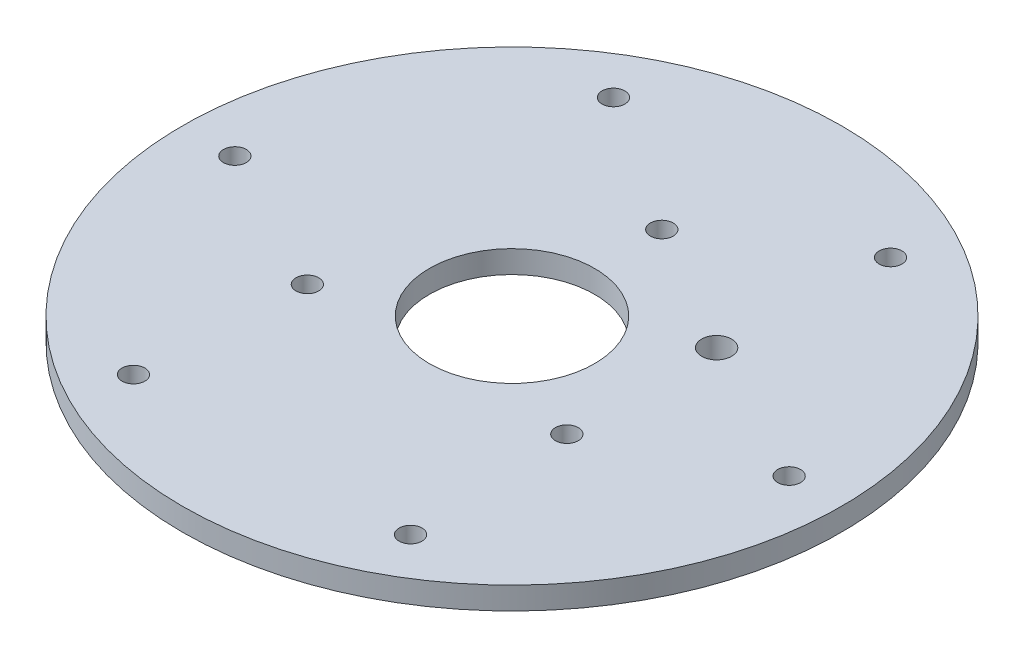
ISO-10303-21;
HEADER;
FILE_DESCRIPTION(('STEP AP214'),'2;1');
FILE_NAME('part.step','',(''),(''),'','','');
FILE_SCHEMA(('AUTOMOTIVE_DESIGN { 1 0 10303 214 1 1 1 1 }'));
ENDSEC;
DATA;
#1=APPLICATION_CONTEXT('core data for automotive mechanical design processes');
#2=APPLICATION_PROTOCOL_DEFINITION('international standard','automotive_design',2000,#1);
#3=PRODUCT_CONTEXT('',#1,'mechanical');
#4=PRODUCT('Part','Part','',(#3));
#5=PRODUCT_RELATED_PRODUCT_CATEGORY('part','',(#4));
#6=PRODUCT_DEFINITION_FORMATION('','',#4);
#7=PRODUCT_DEFINITION_CONTEXT('part definition',#1,'design');
#8=PRODUCT_DEFINITION('design','',#6,#7);
#9=PRODUCT_DEFINITION_SHAPE('','',#8);
#10=(LENGTH_UNIT() NAMED_UNIT(*) SI_UNIT(.MILLI.,.METRE.));
#11=(NAMED_UNIT(*) PLANE_ANGLE_UNIT() SI_UNIT($,.RADIAN.));
#12=(NAMED_UNIT(*) SI_UNIT($,.STERADIAN.) SOLID_ANGLE_UNIT());
#13=UNCERTAINTY_MEASURE_WITH_UNIT(LENGTH_MEASURE(1.E-05),#10,'distance_accuracy_value','');
#14=(GEOMETRIC_REPRESENTATION_CONTEXT(3) GLOBAL_UNCERTAINTY_ASSIGNED_CONTEXT((#13)) GLOBAL_UNIT_ASSIGNED_CONTEXT((#10,
#11,#12)) REPRESENTATION_CONTEXT('',''));
#15=CARTESIAN_POINT('',(0.,0.,0.));
#16=DIRECTION('',(0.,0.,1.));
#17=DIRECTION('',(1.,0.,0.));
#18=AXIS2_PLACEMENT_3D('',#15,#16,#17);
#19=CARTESIAN_POINT('',(37.,3.,0.));
#20=DIRECTION('',(0.,-1.,0.));
#21=DIRECTION('',(0.,0.,-1.));
#22=AXIS2_PLACEMENT_3D('',#19,#20,#21);
#23=CYLINDRICAL_SURFACE('',#22,1.525);
#24=CARTESIAN_POINT('',(37.,3.,0.));
#25=DIRECTION('',(0.,1.,0.));
#26=DIRECTION('',(0.,0.,1.));
#27=AXIS2_PLACEMENT_3D('',#24,#25,#26);
#28=CIRCLE('',#27,1.525);
#29=CARTESIAN_POINT('',(37.,3.,1.525));
#30=VERTEX_POINT('',#29);
#31=EDGE_CURVE('E58',#30,#30,#28,.T.);
#32=ORIENTED_EDGE('',*,*,#31,.T.);
#33=EDGE_LOOP('',(#32));
#34=FACE_BOUND('',#33,.T.);
#35=CARTESIAN_POINT('',(37.,0.,0.));
#36=DIRECTION('',(0.,1.,0.));
#37=DIRECTION('',(0.,0.,1.));
#38=AXIS2_PLACEMENT_3D('',#35,#36,#37);
#39=CIRCLE('',#38,1.525);
#40=CARTESIAN_POINT('',(37.,0.,1.525));
#41=VERTEX_POINT('',#40);
#42=EDGE_CURVE('E109',#41,#41,#39,.T.);
#43=ORIENTED_EDGE('',*,*,#42,.F.);
#44=EDGE_LOOP('',(#43));
#45=FACE_BOUND('',#44,.T.);
#46=ADVANCED_FACE('F51',(#34,#45),#23,.F.);
#47=CARTESIAN_POINT('',(18.5,3.,32.0429399400242));
#48=DIRECTION('',(0.,-1.,0.));
#49=DIRECTION('',(0.,0.,-1.));
#50=AXIS2_PLACEMENT_3D('',#47,#48,#49);
#51=CYLINDRICAL_SURFACE('',#50,1.525);
#52=CARTESIAN_POINT('',(18.5,3.,32.0429399400242));
#53=DIRECTION('',(0.,1.,0.));
#54=DIRECTION('',(0.,0.,1.));
#55=AXIS2_PLACEMENT_3D('',#52,#53,#54);
#56=CIRCLE('',#55,1.525);
#57=CARTESIAN_POINT('',(18.5,3.,33.5679399400242));
#58=VERTEX_POINT('',#57);
#59=EDGE_CURVE('E66',#58,#58,#56,.T.);
#60=ORIENTED_EDGE('',*,*,#59,.T.);
#61=EDGE_LOOP('',(#60));
#62=FACE_BOUND('',#61,.T.);
#63=CARTESIAN_POINT('',(18.5,0.,32.0429399400242));
#64=DIRECTION('',(0.,1.,0.));
#65=DIRECTION('',(0.,0.,1.));
#66=AXIS2_PLACEMENT_3D('',#63,#64,#65);
#67=CIRCLE('',#66,1.525);
#68=CARTESIAN_POINT('',(18.5,0.,33.5679399400242));
#69=VERTEX_POINT('',#68);
#70=EDGE_CURVE('E110',#69,#69,#67,.T.);
#71=ORIENTED_EDGE('',*,*,#70,.F.);
#72=EDGE_LOOP('',(#71));
#73=FACE_BOUND('',#72,.T.);
#74=ADVANCED_FACE('F164',(#62,#73),#51,.F.);
#75=CARTESIAN_POINT('',(-18.5,3.,32.0429399400242));
#76=DIRECTION('',(0.,-1.,0.));
#77=DIRECTION('',(0.,0.,-1.));
#78=AXIS2_PLACEMENT_3D('',#75,#76,#77);
#79=CYLINDRICAL_SURFACE('',#78,1.52499999999999);
#80=CARTESIAN_POINT('',(-18.5,3.,32.0429399400242));
#81=DIRECTION('',(0.,1.,0.));
#82=DIRECTION('',(0.,0.,1.));
#83=AXIS2_PLACEMENT_3D('',#80,#81,#82);
#84=CIRCLE('',#83,1.52499999999999);
#85=CARTESIAN_POINT('',(-18.5,3.,33.5679399400242));
#86=VERTEX_POINT('',#85);
#87=EDGE_CURVE('E160',#86,#86,#84,.T.);
#88=ORIENTED_EDGE('',*,*,#87,.T.);
#89=EDGE_LOOP('',(#88));
#90=FACE_BOUND('',#89,.T.);
#91=CARTESIAN_POINT('',(-18.5,0.,32.0429399400242));
#92=DIRECTION('',(0.,1.,0.));
#93=DIRECTION('',(0.,0.,1.));
#94=AXIS2_PLACEMENT_3D('',#91,#92,#93);
#95=CIRCLE('',#94,1.52499999999999);
#96=CARTESIAN_POINT('',(-18.5,0.,33.5679399400242));
#97=VERTEX_POINT('',#96);
#98=EDGE_CURVE('E102',#97,#97,#95,.T.);
#99=ORIENTED_EDGE('',*,*,#98,.F.);
#100=EDGE_LOOP('',(#99));
#101=FACE_BOUND('',#100,.T.);
#102=ADVANCED_FACE('F185',(#90,#101),#79,.F.);
#103=CARTESIAN_POINT('',(-37.,3.,0.));
#104=DIRECTION('',(0.,-1.,0.));
#105=DIRECTION('',(0.,0.,-1.));
#106=AXIS2_PLACEMENT_3D('',#103,#104,#105);
#107=CYLINDRICAL_SURFACE('',#106,1.525);
#108=CARTESIAN_POINT('',(-37.,3.,0.));
#109=DIRECTION('',(0.,1.,0.));
#110=DIRECTION('',(0.,0.,1.));
#111=AXIS2_PLACEMENT_3D('',#108,#109,#110);
#112=CIRCLE('',#111,1.525);
#113=CARTESIAN_POINT('',(-37.,3.,1.525));
#114=VERTEX_POINT('',#113);
#115=EDGE_CURVE('E153',#114,#114,#112,.T.);
#116=ORIENTED_EDGE('',*,*,#115,.T.);
#117=EDGE_LOOP('',(#116));
#118=FACE_BOUND('',#117,.T.);
#119=CARTESIAN_POINT('',(-37.,0.,0.));
#120=DIRECTION('',(0.,1.,0.));
#121=DIRECTION('',(0.,0.,1.));
#122=AXIS2_PLACEMENT_3D('',#119,#120,#121);
#123=CIRCLE('',#122,1.525);
#124=CARTESIAN_POINT('',(-37.,0.,1.525));
#125=VERTEX_POINT('',#124);
#126=EDGE_CURVE('E99',#125,#125,#123,.T.);
#127=ORIENTED_EDGE('',*,*,#126,.F.);
#128=EDGE_LOOP('',(#127));
#129=FACE_BOUND('',#128,.T.);
#130=ADVANCED_FACE('F189',(#118,#129),#107,.F.);
#131=CARTESIAN_POINT('',(-18.5,3.,-32.0429399400242));
#132=DIRECTION('',(0.,-1.,0.));
#133=DIRECTION('',(0.,0.,-1.));
#134=AXIS2_PLACEMENT_3D('',#131,#132,#133);
#135=CYLINDRICAL_SURFACE('',#134,1.525);
#136=CARTESIAN_POINT('',(-18.5,3.,-32.0429399400242));
#137=DIRECTION('',(0.,1.,0.));
#138=DIRECTION('',(0.,0.,1.));
#139=AXIS2_PLACEMENT_3D('',#136,#137,#138);
#140=CIRCLE('',#139,1.525);
#141=CARTESIAN_POINT('',(-18.5,3.,-30.5179399400242));
#142=VERTEX_POINT('',#141);
#143=EDGE_CURVE('E149',#142,#142,#140,.T.);
#144=ORIENTED_EDGE('',*,*,#143,.T.);
#145=EDGE_LOOP('',(#144));
#146=FACE_BOUND('',#145,.T.);
#147=CARTESIAN_POINT('',(-18.5,0.,-32.0429399400242));
#148=DIRECTION('',(0.,1.,0.));
#149=DIRECTION('',(0.,0.,1.));
#150=AXIS2_PLACEMENT_3D('',#147,#148,#149);
#151=CIRCLE('',#150,1.525);
#152=CARTESIAN_POINT('',(-18.5,0.,-30.5179399400242));
#153=VERTEX_POINT('',#152);
#154=EDGE_CURVE('E96',#153,#153,#151,.T.);
#155=ORIENTED_EDGE('',*,*,#154,.F.);
#156=EDGE_LOOP('',(#155));
#157=FACE_BOUND('',#156,.T.);
#158=ADVANCED_FACE('F194',(#146,#157),#135,.F.);
#159=CARTESIAN_POINT('',(18.5,3.,-32.0429399400243));
#160=DIRECTION('',(0.,-1.,0.));
#161=DIRECTION('',(0.,0.,-1.));
#162=AXIS2_PLACEMENT_3D('',#159,#160,#161);
#163=CYLINDRICAL_SURFACE('',#162,1.525);
#164=CARTESIAN_POINT('',(18.5,3.,-32.0429399400243));
#165=DIRECTION('',(0.,1.,0.));
#166=DIRECTION('',(0.,0.,1.));
#167=AXIS2_PLACEMENT_3D('',#164,#165,#166);
#168=CIRCLE('',#167,1.525);
#169=CARTESIAN_POINT('',(18.5,3.,-30.5179399400242));
#170=VERTEX_POINT('',#169);
#171=EDGE_CURVE('E148',#170,#170,#168,.T.);
#172=ORIENTED_EDGE('',*,*,#171,.T.);
#173=EDGE_LOOP('',(#172));
#174=FACE_BOUND('',#173,.T.);
#175=CARTESIAN_POINT('',(18.5,0.,-32.0429399400243));
#176=DIRECTION('',(0.,1.,0.));
#177=DIRECTION('',(0.,0.,1.));
#178=AXIS2_PLACEMENT_3D('',#175,#176,#177);
#179=CIRCLE('',#178,1.525);
#180=CARTESIAN_POINT('',(18.5,0.,-30.5179399400242));
#181=VERTEX_POINT('',#180);
#182=EDGE_CURVE('E95',#181,#181,#179,.T.);
#183=ORIENTED_EDGE('',*,*,#182,.F.);
#184=EDGE_LOOP('',(#183));
#185=FACE_BOUND('',#184,.T.);
#186=ADVANCED_FACE('F197',(#174,#185),#163,.F.);
#187=CARTESIAN_POINT('',(0.,3.,0.));
#188=DIRECTION('',(0.,-1.,0.));
#189=DIRECTION('',(0.,0.,-1.));
#190=AXIS2_PLACEMENT_3D('',#187,#188,#189);
#191=CYLINDRICAL_SURFACE('',#190,11.025);
#192=CARTESIAN_POINT('',(0.,3.,0.));
#193=DIRECTION('',(0.,1.,0.));
#194=DIRECTION('',(0.,0.,1.));
#195=AXIS2_PLACEMENT_3D('',#192,#193,#194);
#196=CIRCLE('',#195,11.025);
#197=CARTESIAN_POINT('',(0.,3.,11.025));
#198=VERTEX_POINT('',#197);
#199=EDGE_CURVE('E142',#198,#198,#196,.T.);
#200=ORIENTED_EDGE('',*,*,#199,.T.);
#201=EDGE_LOOP('',(#200));
#202=FACE_BOUND('',#201,.T.);
#203=CARTESIAN_POINT('',(0.,0.,0.));
#204=DIRECTION('',(0.,1.,0.));
#205=DIRECTION('',(0.,0.,1.));
#206=AXIS2_PLACEMENT_3D('',#203,#204,#205);
#207=CIRCLE('',#206,11.025);
#208=CARTESIAN_POINT('',(0.,0.,11.025));
#209=VERTEX_POINT('',#208);
#210=EDGE_CURVE('E86',#209,#209,#207,.T.);
#211=ORIENTED_EDGE('',*,*,#210,.F.);
#212=EDGE_LOOP('',(#211));
#213=FACE_BOUND('',#212,.T.);
#214=ADVANCED_FACE('F203',(#202,#213),#191,.F.);
#215=CARTESIAN_POINT('',(0.,3.,-20.));
#216=DIRECTION('',(0.,-1.,0.));
#217=DIRECTION('',(0.,0.,-1.));
#218=AXIS2_PLACEMENT_3D('',#215,#216,#217);
#219=CYLINDRICAL_SURFACE('',#218,1.525);
#220=CARTESIAN_POINT('',(0.,3.,-20.));
#221=DIRECTION('',(0.,1.,0.));
#222=DIRECTION('',(0.,0.,1.));
#223=AXIS2_PLACEMENT_3D('',#220,#221,#222);
#224=CIRCLE('',#223,1.525);
#225=CARTESIAN_POINT('',(0.,3.,-18.475));
#226=VERTEX_POINT('',#225);
#227=EDGE_CURVE('E139',#226,#226,#224,.T.);
#228=ORIENTED_EDGE('',*,*,#227,.T.);
#229=EDGE_LOOP('',(#228));
#230=FACE_BOUND('',#229,.T.);
#231=CARTESIAN_POINT('',(0.,0.,-20.));
#232=DIRECTION('',(0.,1.,0.));
#233=DIRECTION('',(0.,0.,1.));
#234=AXIS2_PLACEMENT_3D('',#231,#232,#233);
#235=CIRCLE('',#234,1.525);
#236=CARTESIAN_POINT('',(0.,0.,-18.475));
#237=VERTEX_POINT('',#236);
#238=EDGE_CURVE('E81',#237,#237,#235,.T.);
#239=ORIENTED_EDGE('',*,*,#238,.F.);
#240=EDGE_LOOP('',(#239));
#241=FACE_BOUND('',#240,.T.);
#242=ADVANCED_FACE('F202',(#230,#241),#219,.F.);
#243=CARTESIAN_POINT('',(17.3205080756888,3.,10.));
#244=DIRECTION('',(0.,-1.,0.));
#245=DIRECTION('',(0.,0.,-1.));
#246=AXIS2_PLACEMENT_3D('',#243,#244,#245);
#247=CYLINDRICAL_SURFACE('',#246,1.525);
#248=CARTESIAN_POINT('',(17.3205080756888,3.,10.));
#249=DIRECTION('',(0.,1.,0.));
#250=DIRECTION('',(0.,0.,1.));
#251=AXIS2_PLACEMENT_3D('',#248,#249,#250);
#252=CIRCLE('',#251,1.525);
#253=CARTESIAN_POINT('',(17.3205080756888,3.,11.525));
#254=VERTEX_POINT('',#253);
#255=EDGE_CURVE('E131',#254,#254,#252,.T.);
#256=ORIENTED_EDGE('',*,*,#255,.T.);
#257=EDGE_LOOP('',(#256));
#258=FACE_BOUND('',#257,.T.);
#259=CARTESIAN_POINT('',(17.3205080756888,0.,10.));
#260=DIRECTION('',(0.,1.,0.));
#261=DIRECTION('',(0.,0.,1.));
#262=AXIS2_PLACEMENT_3D('',#259,#260,#261);
#263=CIRCLE('',#262,1.525);
#264=CARTESIAN_POINT('',(17.3205080756888,0.,11.525));
#265=VERTEX_POINT('',#264);
#266=EDGE_CURVE('E77',#265,#265,#263,.T.);
#267=ORIENTED_EDGE('',*,*,#266,.F.);
#268=EDGE_LOOP('',(#267));
#269=FACE_BOUND('',#268,.T.);
#270=ADVANCED_FACE('F207',(#258,#269),#247,.F.);
#271=CARTESIAN_POINT('',(-17.3205080756888,3.,10.));
#272=DIRECTION('',(0.,-1.,0.));
#273=DIRECTION('',(0.,0.,-1.));
#274=AXIS2_PLACEMENT_3D('',#271,#272,#273);
#275=CYLINDRICAL_SURFACE('',#274,1.525);
#276=CARTESIAN_POINT('',(-17.3205080756888,3.,10.));
#277=DIRECTION('',(0.,1.,0.));
#278=DIRECTION('',(0.,0.,1.));
#279=AXIS2_PLACEMENT_3D('',#276,#277,#278);
#280=CIRCLE('',#279,1.525);
#281=CARTESIAN_POINT('',(-17.3205080756888,3.,11.525));
#282=VERTEX_POINT('',#281);
#283=EDGE_CURVE('E127',#282,#282,#280,.T.);
#284=ORIENTED_EDGE('',*,*,#283,.T.);
#285=EDGE_LOOP('',(#284));
#286=FACE_BOUND('',#285,.T.);
#287=CARTESIAN_POINT('',(-17.3205080756888,0.,10.));
#288=DIRECTION('',(0.,1.,0.));
#289=DIRECTION('',(0.,0.,1.));
#290=AXIS2_PLACEMENT_3D('',#287,#288,#289);
#291=CIRCLE('',#290,1.525);
#292=CARTESIAN_POINT('',(-17.3205080756888,0.,11.525));
#293=VERTEX_POINT('',#292);
#294=EDGE_CURVE('E78',#293,#293,#291,.T.);
#295=ORIENTED_EDGE('',*,*,#294,.F.);
#296=EDGE_LOOP('',(#295));
#297=FACE_BOUND('',#296,.T.);
#298=ADVANCED_FACE('F215',(#286,#297),#275,.F.);
#299=CARTESIAN_POINT('',(17.3205080756888,3.,-10.));
#300=DIRECTION('',(0.,-1.,0.));
#301=DIRECTION('',(0.,0.,-1.));
#302=AXIS2_PLACEMENT_3D('',#299,#300,#301);
#303=CYLINDRICAL_SURFACE('',#302,2.);
#304=CARTESIAN_POINT('',(17.3205080756888,3.,-10.));
#305=DIRECTION('',(0.,1.,0.));
#306=DIRECTION('',(0.,0.,1.));
#307=AXIS2_PLACEMENT_3D('',#304,#305,#306);
#308=CIRCLE('',#307,2.);
#309=CARTESIAN_POINT('',(17.3205080756888,3.,-8.00000000000003));
#310=VERTEX_POINT('',#309);
#311=EDGE_CURVE('E119',#310,#310,#308,.T.);
#312=ORIENTED_EDGE('',*,*,#311,.T.);
#313=EDGE_LOOP('',(#312));
#314=FACE_BOUND('',#313,.T.);
#315=CARTESIAN_POINT('',(17.3205080756888,0.,-10.));
#316=DIRECTION('',(0.,1.,0.));
#317=DIRECTION('',(0.,0.,1.));
#318=AXIS2_PLACEMENT_3D('',#315,#316,#317);
#319=CIRCLE('',#318,2.);
#320=CARTESIAN_POINT('',(17.3205080756888,0.,-8.00000000000003));
#321=VERTEX_POINT('',#320);
#322=EDGE_CURVE('E71',#321,#321,#319,.T.);
#323=ORIENTED_EDGE('',*,*,#322,.F.);
#324=EDGE_LOOP('',(#323));
#325=FACE_BOUND('',#324,.T.);
#326=ADVANCED_FACE('F52',(#314,#325),#303,.F.);
#327=CARTESIAN_POINT('',(0.,3.,0.));
#328=DIRECTION('',(0.,-1.,0.));
#329=DIRECTION('',(0.,0.,-1.));
#330=AXIS2_PLACEMENT_3D('',#327,#328,#329);
#331=CYLINDRICAL_SURFACE('',#330,44.);
#332=CARTESIAN_POINT('',(0.,3.,0.));
#333=DIRECTION('',(0.,1.,0.));
#334=DIRECTION('',(0.,0.,1.));
#335=AXIS2_PLACEMENT_3D('',#332,#333,#334);
#336=CIRCLE('',#335,44.);
#337=CARTESIAN_POINT('',(0.,3.,44.));
#338=VERTEX_POINT('',#337);
#339=EDGE_CURVE('E10',#338,#338,#336,.T.);
#340=ORIENTED_EDGE('',*,*,#339,.F.);
#341=EDGE_LOOP('',(#340));
#342=FACE_BOUND('',#341,.T.);
#343=CARTESIAN_POINT('',(0.,0.,0.));
#344=DIRECTION('',(0.,1.,0.));
#345=DIRECTION('',(0.,0.,1.));
#346=AXIS2_PLACEMENT_3D('',#343,#344,#345);
#347=CIRCLE('',#346,44.);
#348=CARTESIAN_POINT('',(0.,0.,44.));
#349=VERTEX_POINT('',#348);
#350=EDGE_CURVE('E54',#349,#349,#347,.T.);
#351=ORIENTED_EDGE('',*,*,#350,.T.);
#352=EDGE_LOOP('',(#351));
#353=FACE_BOUND('',#352,.T.);
#354=ADVANCED_FACE('F175',(#342,#353),#331,.T.);
#355=CARTESIAN_POINT('',(0.,3.,0.));
#356=DIRECTION('',(0.,1.,0.));
#357=DIRECTION('',(0.,0.,1.));
#358=AXIS2_PLACEMENT_3D('',#355,#356,#357);
#359=PLANE('',#358);
#360=ORIENTED_EDGE('',*,*,#311,.F.);
#361=EDGE_LOOP('',(#360));
#362=FACE_BOUND('',#361,.T.);
#363=ORIENTED_EDGE('',*,*,#283,.F.);
#364=EDGE_LOOP('',(#363));
#365=FACE_BOUND('',#364,.T.);
#366=ORIENTED_EDGE('',*,*,#255,.F.);
#367=EDGE_LOOP('',(#366));
#368=FACE_BOUND('',#367,.T.);
#369=ORIENTED_EDGE('',*,*,#227,.F.);
#370=EDGE_LOOP('',(#369));
#371=FACE_BOUND('',#370,.T.);
#372=ORIENTED_EDGE('',*,*,#199,.F.);
#373=EDGE_LOOP('',(#372));
#374=FACE_BOUND('',#373,.T.);
#375=ORIENTED_EDGE('',*,*,#171,.F.);
#376=EDGE_LOOP('',(#375));
#377=FACE_BOUND('',#376,.T.);
#378=ORIENTED_EDGE('',*,*,#143,.F.);
#379=EDGE_LOOP('',(#378));
#380=FACE_BOUND('',#379,.T.);
#381=ORIENTED_EDGE('',*,*,#115,.F.);
#382=EDGE_LOOP('',(#381));
#383=FACE_BOUND('',#382,.T.);
#384=ORIENTED_EDGE('',*,*,#87,.F.);
#385=EDGE_LOOP('',(#384));
#386=FACE_BOUND('',#385,.T.);
#387=ORIENTED_EDGE('',*,*,#59,.F.);
#388=EDGE_LOOP('',(#387));
#389=FACE_BOUND('',#388,.T.);
#390=ORIENTED_EDGE('',*,*,#31,.F.);
#391=EDGE_LOOP('',(#390));
#392=FACE_BOUND('',#391,.T.);
#393=ORIENTED_EDGE('',*,*,#339,.T.);
#394=EDGE_LOOP('',(#393));
#395=FACE_BOUND('',#394,.T.);
#396=ADVANCED_FACE('F169',(#362,#365,#368,#371,#374,#377,#380,#383,#386,#389,#392,#395),#359,.T.);
#397=CARTESIAN_POINT('',(0.,0.,0.));
#398=DIRECTION('',(0.,1.,0.));
#399=DIRECTION('',(0.,0.,1.));
#400=AXIS2_PLACEMENT_3D('',#397,#398,#399);
#401=PLANE('',#400);
#402=ORIENTED_EDGE('',*,*,#322,.T.);
#403=EDGE_LOOP('',(#402));
#404=FACE_BOUND('',#403,.T.);
#405=ORIENTED_EDGE('',*,*,#294,.T.);
#406=EDGE_LOOP('',(#405));
#407=FACE_BOUND('',#406,.T.);
#408=ORIENTED_EDGE('',*,*,#266,.T.);
#409=EDGE_LOOP('',(#408));
#410=FACE_BOUND('',#409,.T.);
#411=ORIENTED_EDGE('',*,*,#238,.T.);
#412=EDGE_LOOP('',(#411));
#413=FACE_BOUND('',#412,.T.);
#414=ORIENTED_EDGE('',*,*,#210,.T.);
#415=EDGE_LOOP('',(#414));
#416=FACE_BOUND('',#415,.T.);
#417=ORIENTED_EDGE('',*,*,#182,.T.);
#418=EDGE_LOOP('',(#417));
#419=FACE_BOUND('',#418,.T.);
#420=ORIENTED_EDGE('',*,*,#154,.T.);
#421=EDGE_LOOP('',(#420));
#422=FACE_BOUND('',#421,.T.);
#423=ORIENTED_EDGE('',*,*,#126,.T.);
#424=EDGE_LOOP('',(#423));
#425=FACE_BOUND('',#424,.T.);
#426=ORIENTED_EDGE('',*,*,#98,.T.);
#427=EDGE_LOOP('',(#426));
#428=FACE_BOUND('',#427,.T.);
#429=ORIENTED_EDGE('',*,*,#70,.T.);
#430=EDGE_LOOP('',(#429));
#431=FACE_BOUND('',#430,.T.);
#432=ORIENTED_EDGE('',*,*,#42,.T.);
#433=EDGE_LOOP('',(#432));
#434=FACE_BOUND('',#433,.T.);
#435=ORIENTED_EDGE('',*,*,#350,.F.);
#436=EDGE_LOOP('',(#435));
#437=FACE_BOUND('',#436,.T.);
#438=ADVANCED_FACE('F173',(#404,#407,#410,#413,#416,#419,#422,#425,#428,#431,#434,#437),#401,.F.);
#439=CLOSED_SHELL('',(#46,#74,#102,#130,#158,#186,#214,#242,#270,#298,#326,#354,#396,#438));
#440=MANIFOLD_SOLID_BREP('B2',#439);
#441=ADVANCED_BREP_SHAPE_REPRESENTATION('',(#18,#440),#14);
#442=SHAPE_DEFINITION_REPRESENTATION(#9,#441);
ENDSEC;
END-ISO-10303-21;
